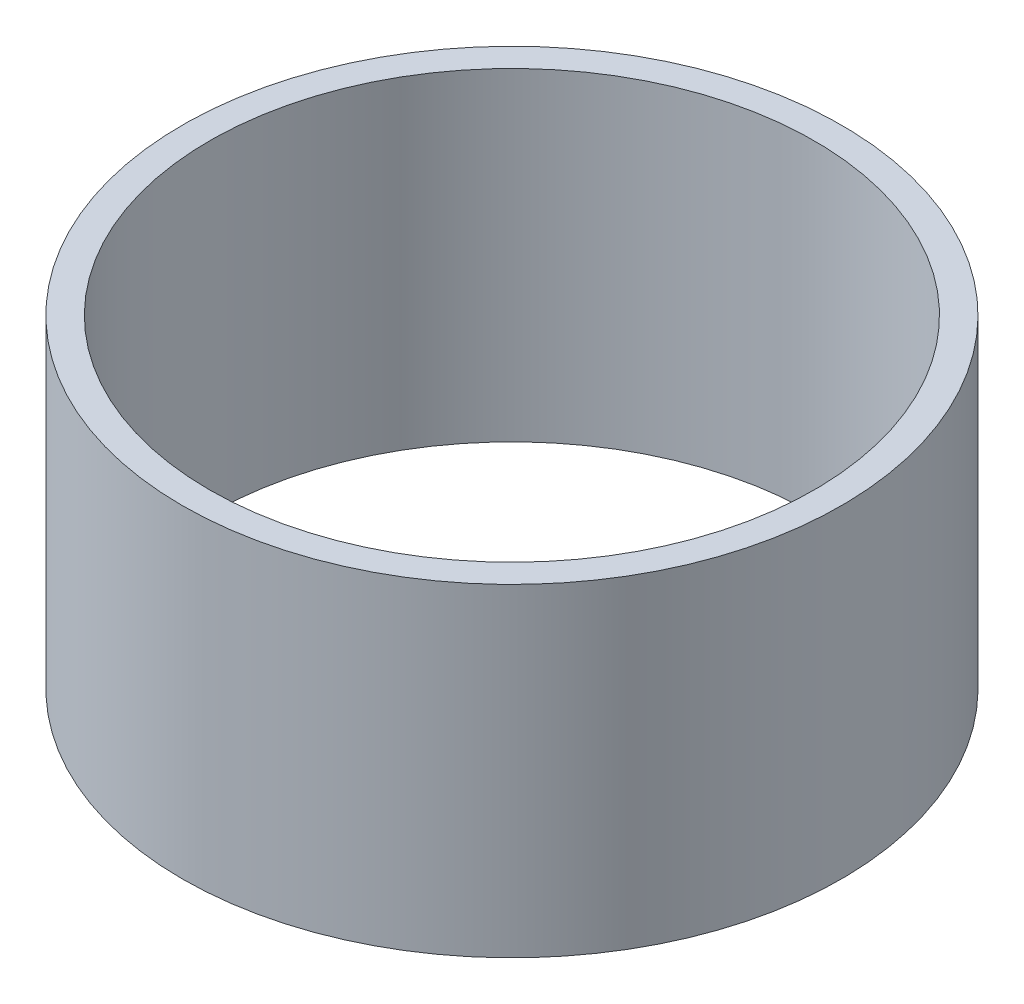
ISO-10303-21;
HEADER;
FILE_DESCRIPTION(('STEP AP214'),'2;1');
FILE_NAME('part.step','',(''),(''),'','','');
FILE_SCHEMA(('AUTOMOTIVE_DESIGN { 1 0 10303 214 1 1 1 1 }'));
ENDSEC;
DATA;
#1=APPLICATION_CONTEXT('core data for automotive mechanical design processes');
#2=APPLICATION_PROTOCOL_DEFINITION('international standard','automotive_design',2000,#1);
#3=PRODUCT_CONTEXT('',#1,'mechanical');
#4=PRODUCT('Part','Part','',(#3));
#5=PRODUCT_RELATED_PRODUCT_CATEGORY('part','',(#4));
#6=PRODUCT_DEFINITION_FORMATION('','',#4);
#7=PRODUCT_DEFINITION_CONTEXT('part definition',#1,'design');
#8=PRODUCT_DEFINITION('design','',#6,#7);
#9=PRODUCT_DEFINITION_SHAPE('','',#8);
#10=(LENGTH_UNIT() NAMED_UNIT(*) SI_UNIT(.MILLI.,.METRE.));
#11=(NAMED_UNIT(*) PLANE_ANGLE_UNIT() SI_UNIT($,.RADIAN.));
#12=(NAMED_UNIT(*) SI_UNIT($,.STERADIAN.) SOLID_ANGLE_UNIT());
#13=UNCERTAINTY_MEASURE_WITH_UNIT(LENGTH_MEASURE(1.E-05),#10,'distance_accuracy_value','');
#14=(GEOMETRIC_REPRESENTATION_CONTEXT(3) GLOBAL_UNCERTAINTY_ASSIGNED_CONTEXT((#13)) GLOBAL_UNIT_ASSIGNED_CONTEXT((#10,
#11,#12)) REPRESENTATION_CONTEXT('',''));
#15=CARTESIAN_POINT('',(0.,0.,0.));
#16=DIRECTION('',(0.,0.,1.));
#17=DIRECTION('',(1.,0.,0.));
#18=AXIS2_PLACEMENT_3D('',#15,#16,#17);
#19=CARTESIAN_POINT('',(0.,14.8717,0.));
#20=DIRECTION('',(0.,1.,0.));
#21=DIRECTION('',(0.,0.,1.));
#22=AXIS2_PLACEMENT_3D('',#19,#20,#21);
#23=PLANE('',#22);
#24=CARTESIAN_POINT('',(0.,14.8717,0.));
#25=DIRECTION('',(0.,1.,0.));
#26=DIRECTION('',(0.,0.,1.));
#27=AXIS2_PLACEMENT_3D('',#24,#25,#26);
#28=CIRCLE('',#27,15.15757818);
#29=CARTESIAN_POINT('',(0.,14.8717,15.15757818));
#30=VERTEX_POINT('',#29);
#31=EDGE_CURVE('E10',#30,#30,#28,.T.);
#32=ORIENTED_EDGE('',*,*,#31,.T.);
#33=EDGE_LOOP('',(#32));
#34=FACE_BOUND('',#33,.T.);
#35=CARTESIAN_POINT('',(0.,14.8717,0.));
#36=DIRECTION('',(0.,1.,0.));
#37=DIRECTION('',(0.,0.,1.));
#38=AXIS2_PLACEMENT_3D('',#35,#36,#37);
#39=CIRCLE('',#38,13.9065);
#40=CARTESIAN_POINT('',(0.,14.8717,13.9065));
#41=VERTEX_POINT('',#40);
#42=EDGE_CURVE('E50',#41,#41,#39,.T.);
#43=ORIENTED_EDGE('',*,*,#42,.F.);
#44=EDGE_LOOP('',(#43));
#45=FACE_BOUND('',#44,.T.);
#46=ADVANCED_FACE('F39',(#34,#45),#23,.T.);
#47=CARTESIAN_POINT('',(0.,0.,0.));
#48=DIRECTION('',(0.,1.,0.));
#49=DIRECTION('',(0.,0.,1.));
#50=AXIS2_PLACEMENT_3D('',#47,#48,#49);
#51=PLANE('',#50);
#52=CARTESIAN_POINT('',(0.,0.,0.));
#53=DIRECTION('',(0.,1.,0.));
#54=DIRECTION('',(0.,0.,1.));
#55=AXIS2_PLACEMENT_3D('',#52,#53,#54);
#56=CIRCLE('',#55,15.15757818);
#57=CARTESIAN_POINT('',(0.,0.,15.15757818));
#58=VERTEX_POINT('',#57);
#59=EDGE_CURVE('E43',#58,#58,#56,.T.);
#60=ORIENTED_EDGE('',*,*,#59,.F.);
#61=EDGE_LOOP('',(#60));
#62=FACE_BOUND('',#61,.T.);
#63=CARTESIAN_POINT('',(0.,0.,0.));
#64=DIRECTION('',(0.,1.,0.));
#65=DIRECTION('',(0.,0.,1.));
#66=AXIS2_PLACEMENT_3D('',#63,#64,#65);
#67=CIRCLE('',#66,13.9065);
#68=CARTESIAN_POINT('',(0.,0.,13.9065));
#69=VERTEX_POINT('',#68);
#70=EDGE_CURVE('E52',#69,#69,#67,.T.);
#71=ORIENTED_EDGE('',*,*,#70,.T.);
#72=EDGE_LOOP('',(#71));
#73=FACE_BOUND('',#72,.T.);
#74=ADVANCED_FACE('F62',(#62,#73),#51,.F.);
#75=CARTESIAN_POINT('',(0.,14.8717,0.));
#76=DIRECTION('',(0.,-1.,0.));
#77=DIRECTION('',(0.,0.,-1.));
#78=AXIS2_PLACEMENT_3D('',#75,#76,#77);
#79=CYLINDRICAL_SURFACE('',#78,15.15757818);
#80=ORIENTED_EDGE('',*,*,#31,.F.);
#81=EDGE_LOOP('',(#80));
#82=FACE_BOUND('',#81,.T.);
#83=ORIENTED_EDGE('',*,*,#59,.T.);
#84=EDGE_LOOP('',(#83));
#85=FACE_BOUND('',#84,.T.);
#86=ADVANCED_FACE('F41',(#82,#85),#79,.T.);
#87=CARTESIAN_POINT('',(0.,14.8717,0.));
#88=DIRECTION('',(0.,-1.,0.));
#89=DIRECTION('',(0.,0.,-1.));
#90=AXIS2_PLACEMENT_3D('',#87,#88,#89);
#91=CYLINDRICAL_SURFACE('',#90,13.9065);
#92=ORIENTED_EDGE('',*,*,#42,.T.);
#93=EDGE_LOOP('',(#92));
#94=FACE_BOUND('',#93,.T.);
#95=ORIENTED_EDGE('',*,*,#70,.F.);
#96=EDGE_LOOP('',(#95));
#97=FACE_BOUND('',#96,.T.);
#98=ADVANCED_FACE('F58',(#94,#97),#91,.F.);
#99=CLOSED_SHELL('',(#46,#74,#86,#98));
#100=MANIFOLD_SOLID_BREP('B2',#99);
#101=ADVANCED_BREP_SHAPE_REPRESENTATION('',(#18,#100),#14);
#102=SHAPE_DEFINITION_REPRESENTATION(#9,#101);
ENDSEC;
END-ISO-10303-21;
